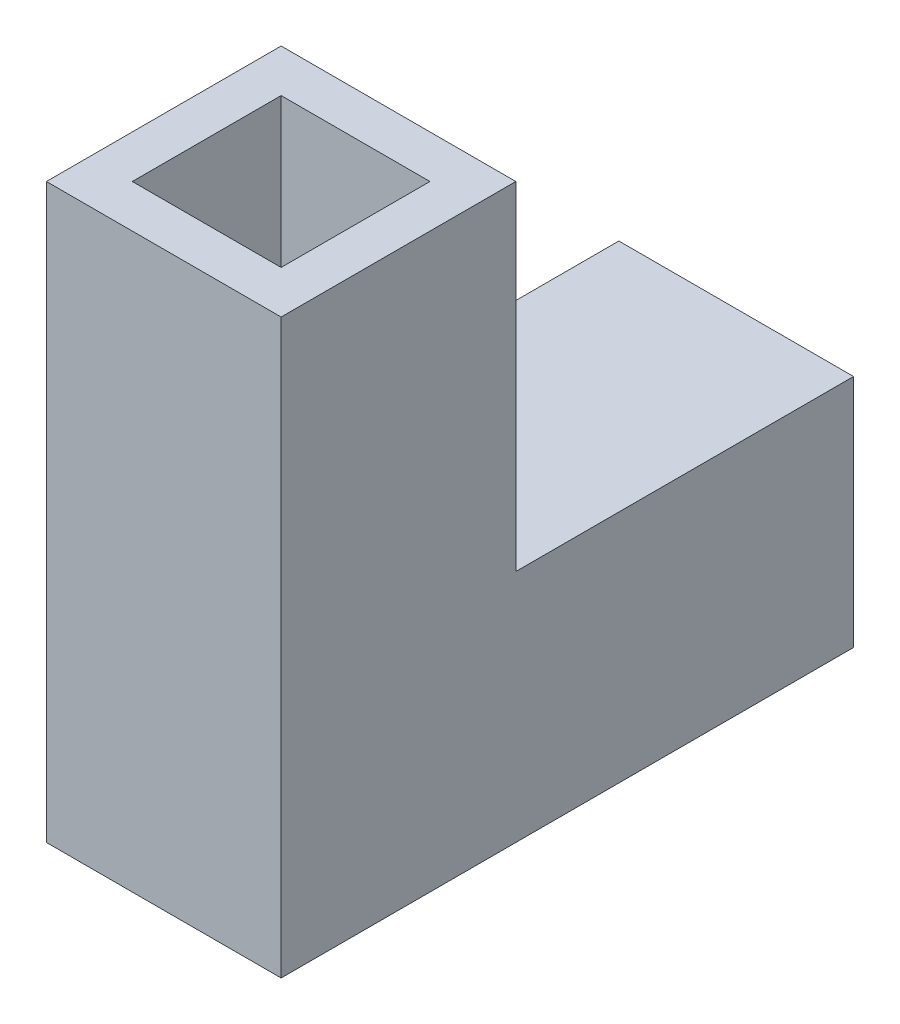
ISO-10303-21;
HEADER;
FILE_DESCRIPTION(('STEP AP214'),'2;1');
FILE_NAME('part.step','',(''),(''),'','','');
FILE_SCHEMA(('AUTOMOTIVE_DESIGN { 1 0 10303 214 1 1 1 1 }'));
ENDSEC;
DATA;
#1=APPLICATION_CONTEXT('core data for automotive mechanical design processes');
#2=APPLICATION_PROTOCOL_DEFINITION('international standard','automotive_design',2000,#1);
#3=PRODUCT_CONTEXT('',#1,'mechanical');
#4=PRODUCT('Part','Part','',(#3));
#5=PRODUCT_RELATED_PRODUCT_CATEGORY('part','',(#4));
#6=PRODUCT_DEFINITION_FORMATION('','',#4);
#7=PRODUCT_DEFINITION_CONTEXT('part definition',#1,'design');
#8=PRODUCT_DEFINITION('design','',#6,#7);
#9=PRODUCT_DEFINITION_SHAPE('','',#8);
#10=(LENGTH_UNIT() NAMED_UNIT(*) SI_UNIT(.MILLI.,.METRE.));
#11=(NAMED_UNIT(*) PLANE_ANGLE_UNIT() SI_UNIT($,.RADIAN.));
#12=(NAMED_UNIT(*) SI_UNIT($,.STERADIAN.) SOLID_ANGLE_UNIT());
#13=UNCERTAINTY_MEASURE_WITH_UNIT(LENGTH_MEASURE(1.E-05),#10,'distance_accuracy_value','');
#14=(GEOMETRIC_REPRESENTATION_CONTEXT(3) GLOBAL_UNCERTAINTY_ASSIGNED_CONTEXT((#13)) GLOBAL_UNIT_ASSIGNED_CONTEXT((#10,
#11,#12)) REPRESENTATION_CONTEXT('',''));
#15=CARTESIAN_POINT('',(0.,0.,0.));
#16=DIRECTION('',(0.,0.,1.));
#17=DIRECTION('',(1.,0.,0.));
#18=AXIS2_PLACEMENT_3D('',#15,#16,#17);
#19=CARTESIAN_POINT('',(0.,20.,0.));
#20=DIRECTION('',(0.,1.,0.));
#21=DIRECTION('',(0.,0.,1.));
#22=AXIS2_PLACEMENT_3D('',#19,#20,#21);
#23=PLANE('',#22);
#24=DIRECTION('',(0.,0.,1.));
#25=VECTOR('',#24,1.);
#26=CARTESIAN_POINT('',(4.1,20.,0.));
#27=LINE('',#26,#25);
#28=CARTESIAN_POINT('',(4.1,20.,-4.1));
#29=VERTEX_POINT('',#28);
#30=CARTESIAN_POINT('',(4.1,20.,4.1));
#31=VERTEX_POINT('',#30);
#32=EDGE_CURVE('E239',#29,#31,#27,.T.);
#33=ORIENTED_EDGE('',*,*,#32,.F.);
#34=DIRECTION('',(1.,0.,0.));
#35=VECTOR('',#34,1.);
#36=CARTESIAN_POINT('',(0.,20.,-4.1));
#37=LINE('',#36,#35);
#38=CARTESIAN_POINT('',(-4.1,20.,-4.1));
#39=VERTEX_POINT('',#38);
#40=EDGE_CURVE('E243',#39,#29,#37,.T.);
#41=ORIENTED_EDGE('',*,*,#40,.F.);
#42=DIRECTION('',(0.,0.,1.));
#43=VECTOR('',#42,1.);
#44=CARTESIAN_POINT('',(-4.1,20.,0.));
#45=LINE('',#44,#43);
#46=CARTESIAN_POINT('',(-4.1,20.,4.1));
#47=VERTEX_POINT('',#46);
#48=EDGE_CURVE('E248',#39,#47,#45,.T.);
#49=ORIENTED_EDGE('',*,*,#48,.T.);
#50=DIRECTION('',(1.,0.,0.));
#51=VECTOR('',#50,1.);
#52=CARTESIAN_POINT('',(0.,20.,4.1));
#53=LINE('',#52,#51);
#54=EDGE_CURVE('E251',#47,#31,#53,.T.);
#55=ORIENTED_EDGE('',*,*,#54,.T.);
#56=EDGE_LOOP('',(#33,#41,#49,#55));
#57=FACE_BOUND('',#56,.T.);
#58=DIRECTION('',(1.,0.,0.));
#59=VECTOR('',#58,1.);
#60=CARTESIAN_POINT('',(0.,20.,-2.6));
#61=LINE('',#60,#59);
#62=CARTESIAN_POINT('',(-2.6,20.,-2.6));
#63=VERTEX_POINT('',#62);
#64=CARTESIAN_POINT('',(2.6,20.,-2.6));
#65=VERTEX_POINT('',#64);
#66=EDGE_CURVE('E202',#63,#65,#61,.T.);
#67=ORIENTED_EDGE('',*,*,#66,.T.);
#68=DIRECTION('',(0.,0.,1.));
#69=VECTOR('',#68,1.);
#70=CARTESIAN_POINT('',(2.6,20.,0.));
#71=LINE('',#70,#69);
#72=CARTESIAN_POINT('',(2.6,20.,2.6));
#73=VERTEX_POINT('',#72);
#74=EDGE_CURVE('E157',#65,#73,#71,.T.);
#75=ORIENTED_EDGE('',*,*,#74,.T.);
#76=DIRECTION('',(1.,0.,0.));
#77=VECTOR('',#76,1.);
#78=CARTESIAN_POINT('',(0.,20.,2.6));
#79=LINE('',#78,#77);
#80=CARTESIAN_POINT('',(-2.6,20.,2.6));
#81=VERTEX_POINT('',#80);
#82=EDGE_CURVE('E142',#81,#73,#79,.T.);
#83=ORIENTED_EDGE('',*,*,#82,.F.);
#84=DIRECTION('',(0.,0.,1.));
#85=VECTOR('',#84,1.);
#86=CARTESIAN_POINT('',(-2.6,20.,0.));
#87=LINE('',#86,#85);
#88=EDGE_CURVE('E206',#63,#81,#87,.T.);
#89=ORIENTED_EDGE('',*,*,#88,.F.);
#90=EDGE_LOOP('',(#67,#75,#83,#89));
#91=FACE_BOUND('',#90,.T.);
#92=ADVANCED_FACE('F49',(#57,#91),#23,.T.);
#93=CARTESIAN_POINT('',(4.1,20.,0.));
#94=DIRECTION('',(1.,0.,0.));
#95=DIRECTION('',(0.,0.,-1.));
#96=AXIS2_PLACEMENT_3D('',#93,#94,#95);
#97=PLANE('',#96);
#98=DIRECTION('',(0.,-1.,0.));
#99=VECTOR('',#98,1.);
#100=CARTESIAN_POINT('',(4.1,20.,4.1));
#101=LINE('',#100,#99);
#102=CARTESIAN_POINT('',(4.1,0.,4.1));
#103=VERTEX_POINT('',#102);
#104=EDGE_CURVE('E254',#31,#103,#101,.T.);
#105=ORIENTED_EDGE('',*,*,#104,.T.);
#106=DIRECTION('',(0.,0.,1.));
#107=VECTOR('',#106,1.);
#108=CARTESIAN_POINT('',(4.1,0.,0.));
#109=LINE('',#108,#107);
#110=CARTESIAN_POINT('',(4.1,0.,-15.9));
#111=VERTEX_POINT('',#110);
#112=EDGE_CURVE('E238',#111,#103,#109,.T.);
#113=ORIENTED_EDGE('',*,*,#112,.F.);
#114=DIRECTION('',(0.,1.,0.));
#115=VECTOR('',#114,1.);
#116=CARTESIAN_POINT('',(4.1,0.,-15.9));
#117=LINE('',#116,#115);
#118=CARTESIAN_POINT('',(4.1,8.2,-15.9));
#119=VERTEX_POINT('',#118);
#120=EDGE_CURVE('E180',#111,#119,#117,.T.);
#121=ORIENTED_EDGE('',*,*,#120,.T.);
#122=DIRECTION('',(0.,0.,1.));
#123=VECTOR('',#122,1.);
#124=CARTESIAN_POINT('',(4.1,8.2,-15.9));
#125=LINE('',#124,#123);
#126=CARTESIAN_POINT('',(4.1,8.2,-4.1));
#127=VERTEX_POINT('',#126);
#128=EDGE_CURVE('E226',#119,#127,#125,.T.);
#129=ORIENTED_EDGE('',*,*,#128,.T.);
#130=DIRECTION('',(0.,-1.,0.));
#131=VECTOR('',#130,1.);
#132=CARTESIAN_POINT('',(4.1,20.,-4.1));
#133=LINE('',#132,#131);
#134=EDGE_CURVE('E11',#29,#127,#133,.T.);
#135=ORIENTED_EDGE('',*,*,#134,.F.);
#136=ORIENTED_EDGE('',*,*,#32,.T.);
#137=EDGE_LOOP('',(#105,#113,#121,#129,#135,#136));
#138=FACE_BOUND('',#137,.T.);
#139=ADVANCED_FACE('F51',(#138),#97,.T.);
#140=CARTESIAN_POINT('',(0.,20.,-4.1));
#141=DIRECTION('',(0.,0.,-1.));
#142=DIRECTION('',(-1.,0.,0.));
#143=AXIS2_PLACEMENT_3D('',#140,#141,#142);
#144=PLANE('',#143);
#145=DIRECTION('',(1.,0.,0.));
#146=VECTOR('',#145,1.);
#147=CARTESIAN_POINT('',(0.,8.2,-4.1));
#148=LINE('',#147,#146);
#149=CARTESIAN_POINT('',(-4.1,8.2,-4.1));
#150=VERTEX_POINT('',#149);
#151=EDGE_CURVE('E231',#150,#127,#148,.T.);
#152=ORIENTED_EDGE('',*,*,#151,.F.);
#153=DIRECTION('',(0.,-1.,0.));
#154=VECTOR('',#153,1.);
#155=CARTESIAN_POINT('',(-4.1,20.,-4.1));
#156=LINE('',#155,#154);
#157=EDGE_CURVE('E58',#39,#150,#156,.T.);
#158=ORIENTED_EDGE('',*,*,#157,.F.);
#159=ORIENTED_EDGE('',*,*,#40,.T.);
#160=ORIENTED_EDGE('',*,*,#134,.T.);
#161=EDGE_LOOP('',(#152,#158,#159,#160));
#162=FACE_BOUND('',#161,.T.);
#163=ADVANCED_FACE('F296',(#162),#144,.T.);
#164=CARTESIAN_POINT('',(-4.1,20.,0.));
#165=DIRECTION('',(1.,0.,0.));
#166=DIRECTION('',(0.,0.,-1.));
#167=AXIS2_PLACEMENT_3D('',#164,#165,#166);
#168=PLANE('',#167);
#169=ORIENTED_EDGE('',*,*,#157,.T.);
#170=DIRECTION('',(0.,0.,1.));
#171=VECTOR('',#170,1.);
#172=CARTESIAN_POINT('',(-4.1,8.2,-15.9));
#173=LINE('',#172,#171);
#174=CARTESIAN_POINT('',(-4.1,8.2,-15.9));
#175=VERTEX_POINT('',#174);
#176=EDGE_CURVE('E227',#175,#150,#173,.T.);
#177=ORIENTED_EDGE('',*,*,#176,.F.);
#178=DIRECTION('',(0.,-1.,0.));
#179=VECTOR('',#178,1.);
#180=CARTESIAN_POINT('',(-4.1,0.,-15.9));
#181=LINE('',#180,#179);
#182=CARTESIAN_POINT('',(-4.1,0.,-15.9));
#183=VERTEX_POINT('',#182);
#184=EDGE_CURVE('E218',#175,#183,#181,.T.);
#185=ORIENTED_EDGE('',*,*,#184,.T.);
#186=DIRECTION('',(0.,0.,1.));
#187=VECTOR('',#186,1.);
#188=CARTESIAN_POINT('',(-4.1,0.,0.));
#189=LINE('',#188,#187);
#190=CARTESIAN_POINT('',(-4.1,0.,4.1));
#191=VERTEX_POINT('',#190);
#192=EDGE_CURVE('E258',#183,#191,#189,.T.);
#193=ORIENTED_EDGE('',*,*,#192,.T.);
#194=DIRECTION('',(0.,-1.,0.));
#195=VECTOR('',#194,1.);
#196=CARTESIAN_POINT('',(-4.1,20.,4.1));
#197=LINE('',#196,#195);
#198=EDGE_CURVE('E267',#47,#191,#197,.T.);
#199=ORIENTED_EDGE('',*,*,#198,.F.);
#200=ORIENTED_EDGE('',*,*,#48,.F.);
#201=EDGE_LOOP('',(#169,#177,#185,#193,#199,#200));
#202=FACE_BOUND('',#201,.T.);
#203=ADVANCED_FACE('F273',(#202),#168,.F.);
#204=CARTESIAN_POINT('',(0.,20.,4.1));
#205=DIRECTION('',(0.,0.,-1.));
#206=DIRECTION('',(-1.,0.,0.));
#207=AXIS2_PLACEMENT_3D('',#204,#205,#206);
#208=PLANE('',#207);
#209=ORIENTED_EDGE('',*,*,#198,.T.);
#210=DIRECTION('',(1.,0.,0.));
#211=VECTOR('',#210,1.);
#212=CARTESIAN_POINT('',(0.,0.,4.1));
#213=LINE('',#212,#211);
#214=EDGE_CURVE('E244',#191,#103,#213,.T.);
#215=ORIENTED_EDGE('',*,*,#214,.T.);
#216=ORIENTED_EDGE('',*,*,#104,.F.);
#217=ORIENTED_EDGE('',*,*,#54,.F.);
#218=EDGE_LOOP('',(#209,#215,#216,#217));
#219=FACE_BOUND('',#218,.T.);
#220=ADVANCED_FACE('F292',(#219),#208,.F.);
#221=CARTESIAN_POINT('',(0.,0.,0.));
#222=DIRECTION('',(0.,1.,0.));
#223=DIRECTION('',(0.,0.,1.));
#224=AXIS2_PLACEMENT_3D('',#221,#222,#223);
#225=PLANE('',#224);
#226=ORIENTED_EDGE('',*,*,#112,.T.);
#227=ORIENTED_EDGE('',*,*,#214,.F.);
#228=ORIENTED_EDGE('',*,*,#192,.F.);
#229=DIRECTION('',(1.,0.,0.));
#230=VECTOR('',#229,1.);
#231=CARTESIAN_POINT('',(0.,0.,-15.9));
#232=LINE('',#231,#230);
#233=EDGE_CURVE('E222',#183,#111,#232,.T.);
#234=ORIENTED_EDGE('',*,*,#233,.T.);
#235=EDGE_LOOP('',(#226,#227,#228,#234));
#236=FACE_BOUND('',#235,.T.);
#237=ADVANCED_FACE('F289',(#236),#225,.F.);
#238=CARTESIAN_POINT('',(0.,8.2,-15.9));
#239=DIRECTION('',(0.,1.,0.));
#240=DIRECTION('',(0.,0.,1.));
#241=AXIS2_PLACEMENT_3D('',#238,#239,#240);
#242=PLANE('',#241);
#243=ORIENTED_EDGE('',*,*,#176,.T.);
#244=ORIENTED_EDGE('',*,*,#151,.T.);
#245=ORIENTED_EDGE('',*,*,#128,.F.);
#246=DIRECTION('',(-1.,0.,0.));
#247=VECTOR('',#246,1.);
#248=CARTESIAN_POINT('',(0.,8.2,-15.9));
#249=LINE('',#248,#247);
#250=EDGE_CURVE('E214',#119,#175,#249,.T.);
#251=ORIENTED_EDGE('',*,*,#250,.T.);
#252=EDGE_LOOP('',(#243,#244,#245,#251));
#253=FACE_BOUND('',#252,.T.);
#254=ADVANCED_FACE('F279',(#253),#242,.T.);
#255=CARTESIAN_POINT('',(0.,0.,-15.9));
#256=DIRECTION('',(0.,0.,1.));
#257=DIRECTION('',(1.,0.,0.));
#258=AXIS2_PLACEMENT_3D('',#255,#256,#257);
#259=PLANE('',#258);
#260=DIRECTION('',(1.,0.,0.));
#261=VECTOR('',#260,1.);
#262=CARTESIAN_POINT('',(0.,1.5,-15.9));
#263=LINE('',#262,#261);
#264=CARTESIAN_POINT('',(-2.6,1.5,-15.9));
#265=VERTEX_POINT('',#264);
#266=CARTESIAN_POINT('',(2.6,1.5,-15.9));
#267=VERTEX_POINT('',#266);
#268=EDGE_CURVE('E177',#265,#267,#263,.T.);
#269=ORIENTED_EDGE('',*,*,#268,.T.);
#270=DIRECTION('',(0.,1.,0.));
#271=VECTOR('',#270,1.);
#272=CARTESIAN_POINT('',(2.6,0.,-15.9));
#273=LINE('',#272,#271);
#274=CARTESIAN_POINT('',(2.6,6.7,-15.9));
#275=VERTEX_POINT('',#274);
#276=EDGE_CURVE('E161',#267,#275,#273,.T.);
#277=ORIENTED_EDGE('',*,*,#276,.T.);
#278=DIRECTION('',(-1.,0.,0.));
#279=VECTOR('',#278,1.);
#280=CARTESIAN_POINT('',(0.,6.7,-15.9));
#281=LINE('',#280,#279);
#282=CARTESIAN_POINT('',(-2.6,6.7,-15.9));
#283=VERTEX_POINT('',#282);
#284=EDGE_CURVE('E192',#275,#283,#281,.T.);
#285=ORIENTED_EDGE('',*,*,#284,.T.);
#286=DIRECTION('',(0.,-1.,0.));
#287=VECTOR('',#286,1.);
#288=CARTESIAN_POINT('',(-2.6,20.,-15.9));
#289=LINE('',#288,#287);
#290=EDGE_CURVE('E73',#283,#265,#289,.T.);
#291=ORIENTED_EDGE('',*,*,#290,.T.);
#292=EDGE_LOOP('',(#269,#277,#285,#291));
#293=FACE_BOUND('',#292,.T.);
#294=ORIENTED_EDGE('',*,*,#120,.F.);
#295=ORIENTED_EDGE('',*,*,#233,.F.);
#296=ORIENTED_EDGE('',*,*,#184,.F.);
#297=ORIENTED_EDGE('',*,*,#250,.F.);
#298=EDGE_LOOP('',(#294,#295,#296,#297));
#299=FACE_BOUND('',#298,.T.);
#300=ADVANCED_FACE('F283',(#293,#299),#259,.F.);
#301=CARTESIAN_POINT('',(2.6,20.,0.));
#302=DIRECTION('',(1.,0.,0.));
#303=DIRECTION('',(0.,0.,-1.));
#304=AXIS2_PLACEMENT_3D('',#301,#302,#303);
#305=PLANE('',#304);
#306=DIRECTION('',(0.,-1.,0.));
#307=VECTOR('',#306,1.);
#308=CARTESIAN_POINT('',(2.6,20.,2.6));
#309=LINE('',#308,#307);
#310=CARTESIAN_POINT('',(2.6,1.5,2.6));
#311=VERTEX_POINT('',#310);
#312=EDGE_CURVE('E137',#73,#311,#309,.T.);
#313=ORIENTED_EDGE('',*,*,#312,.F.);
#314=ORIENTED_EDGE('',*,*,#74,.F.);
#315=DIRECTION('',(0.,-1.,0.));
#316=VECTOR('',#315,1.);
#317=CARTESIAN_POINT('',(2.6,20.,-2.6));
#318=LINE('',#317,#316);
#319=CARTESIAN_POINT('',(2.6,6.7,-2.6));
#320=VERTEX_POINT('',#319);
#321=EDGE_CURVE('E178',#65,#320,#318,.T.);
#322=ORIENTED_EDGE('',*,*,#321,.T.);
#323=DIRECTION('',(0.,0.,1.));
#324=VECTOR('',#323,1.);
#325=CARTESIAN_POINT('',(2.6,6.7,0.));
#326=LINE('',#325,#324);
#327=EDGE_CURVE('E173',#275,#320,#326,.T.);
#328=ORIENTED_EDGE('',*,*,#327,.F.);
#329=ORIENTED_EDGE('',*,*,#276,.F.);
#330=DIRECTION('',(0.,0.,1.));
#331=VECTOR('',#330,1.);
#332=CARTESIAN_POINT('',(2.6,1.5,0.));
#333=LINE('',#332,#331);
#334=EDGE_CURVE('E153',#267,#311,#333,.T.);
#335=ORIENTED_EDGE('',*,*,#334,.T.);
#336=EDGE_LOOP('',(#313,#314,#322,#328,#329,#335));
#337=FACE_BOUND('',#336,.T.);
#338=ADVANCED_FACE('F159',(#337),#305,.F.);
#339=CARTESIAN_POINT('',(0.,20.,-2.6));
#340=DIRECTION('',(0.,0.,-1.));
#341=DIRECTION('',(-1.,0.,0.));
#342=AXIS2_PLACEMENT_3D('',#339,#340,#341);
#343=PLANE('',#342);
#344=DIRECTION('',(1.,0.,0.));
#345=VECTOR('',#344,1.);
#346=CARTESIAN_POINT('',(0.,6.7,-2.6));
#347=LINE('',#346,#345);
#348=CARTESIAN_POINT('',(-2.6,6.7,-2.6));
#349=VERTEX_POINT('',#348);
#350=EDGE_CURVE('E164',#349,#320,#347,.T.);
#351=ORIENTED_EDGE('',*,*,#350,.T.);
#352=ORIENTED_EDGE('',*,*,#321,.F.);
#353=ORIENTED_EDGE('',*,*,#66,.F.);
#354=DIRECTION('',(0.,-1.,0.));
#355=VECTOR('',#354,1.);
#356=CARTESIAN_POINT('',(-2.6,20.,-2.6));
#357=LINE('',#356,#355);
#358=EDGE_CURVE('E181',#63,#349,#357,.T.);
#359=ORIENTED_EDGE('',*,*,#358,.T.);
#360=EDGE_LOOP('',(#351,#352,#353,#359));
#361=FACE_BOUND('',#360,.T.);
#362=ADVANCED_FACE('F353',(#361),#343,.F.);
#363=CARTESIAN_POINT('',(-2.6,20.,0.));
#364=DIRECTION('',(1.,0.,0.));
#365=DIRECTION('',(0.,0.,-1.));
#366=AXIS2_PLACEMENT_3D('',#363,#364,#365);
#367=PLANE('',#366);
#368=ORIENTED_EDGE('',*,*,#358,.F.);
#369=ORIENTED_EDGE('',*,*,#88,.T.);
#370=DIRECTION('',(0.,-1.,0.));
#371=VECTOR('',#370,1.);
#372=CARTESIAN_POINT('',(-2.6,20.,2.6));
#373=LINE('',#372,#371);
#374=CARTESIAN_POINT('',(-2.6,1.5,2.6));
#375=VERTEX_POINT('',#374);
#376=EDGE_CURVE('E65',#81,#375,#373,.T.);
#377=ORIENTED_EDGE('',*,*,#376,.T.);
#378=DIRECTION('',(0.,0.,1.));
#379=VECTOR('',#378,1.);
#380=CARTESIAN_POINT('',(-2.6,1.5,0.));
#381=LINE('',#380,#379);
#382=EDGE_CURVE('E155',#265,#375,#381,.T.);
#383=ORIENTED_EDGE('',*,*,#382,.F.);
#384=ORIENTED_EDGE('',*,*,#290,.F.);
#385=DIRECTION('',(0.,0.,1.));
#386=VECTOR('',#385,1.);
#387=CARTESIAN_POINT('',(-2.6,6.7,0.));
#388=LINE('',#387,#386);
#389=EDGE_CURVE('E170',#283,#349,#388,.T.);
#390=ORIENTED_EDGE('',*,*,#389,.T.);
#391=EDGE_LOOP('',(#368,#369,#377,#383,#384,#390));
#392=FACE_BOUND('',#391,.T.);
#393=ADVANCED_FACE('F368',(#392),#367,.T.);
#394=CARTESIAN_POINT('',(0.,20.,2.6));
#395=DIRECTION('',(0.,0.,-1.));
#396=DIRECTION('',(-1.,0.,0.));
#397=AXIS2_PLACEMENT_3D('',#394,#395,#396);
#398=PLANE('',#397);
#399=ORIENTED_EDGE('',*,*,#376,.F.);
#400=ORIENTED_EDGE('',*,*,#82,.T.);
#401=ORIENTED_EDGE('',*,*,#312,.T.);
#402=DIRECTION('',(1.,0.,0.));
#403=VECTOR('',#402,1.);
#404=CARTESIAN_POINT('',(0.,1.5,2.6));
#405=LINE('',#404,#403);
#406=EDGE_CURVE('E140',#375,#311,#405,.T.);
#407=ORIENTED_EDGE('',*,*,#406,.F.);
#408=EDGE_LOOP('',(#399,#400,#401,#407));
#409=FACE_BOUND('',#408,.T.);
#410=ADVANCED_FACE('F139',(#409),#398,.T.);
#411=CARTESIAN_POINT('',(0.,1.5,0.));
#412=DIRECTION('',(0.,1.,0.));
#413=DIRECTION('',(0.,0.,1.));
#414=AXIS2_PLACEMENT_3D('',#411,#412,#413);
#415=PLANE('',#414);
#416=ORIENTED_EDGE('',*,*,#334,.F.);
#417=ORIENTED_EDGE('',*,*,#268,.F.);
#418=ORIENTED_EDGE('',*,*,#382,.T.);
#419=ORIENTED_EDGE('',*,*,#406,.T.);
#420=EDGE_LOOP('',(#416,#417,#418,#419));
#421=FACE_BOUND('',#420,.T.);
#422=ADVANCED_FACE('F151',(#421),#415,.T.);
#423=CARTESIAN_POINT('',(0.,6.7,-15.9));
#424=DIRECTION('',(0.,1.,0.));
#425=DIRECTION('',(0.,0.,1.));
#426=AXIS2_PLACEMENT_3D('',#423,#424,#425);
#427=PLANE('',#426);
#428=ORIENTED_EDGE('',*,*,#389,.F.);
#429=ORIENTED_EDGE('',*,*,#284,.F.);
#430=ORIENTED_EDGE('',*,*,#327,.T.);
#431=ORIENTED_EDGE('',*,*,#350,.F.);
#432=EDGE_LOOP('',(#428,#429,#430,#431));
#433=FACE_BOUND('',#432,.T.);
#434=ADVANCED_FACE('F400',(#433),#427,.F.);
#435=CLOSED_SHELL('',(#92,#139,#163,#203,#220,#237,#254,#300,#338,#362,#393,#410,#422,#434));
#436=MANIFOLD_SOLID_BREP('B2',#435);
#437=ADVANCED_BREP_SHAPE_REPRESENTATION('',(#18,#436),#14);
#438=SHAPE_DEFINITION_REPRESENTATION(#9,#437);
ENDSEC;
END-ISO-10303-21;
